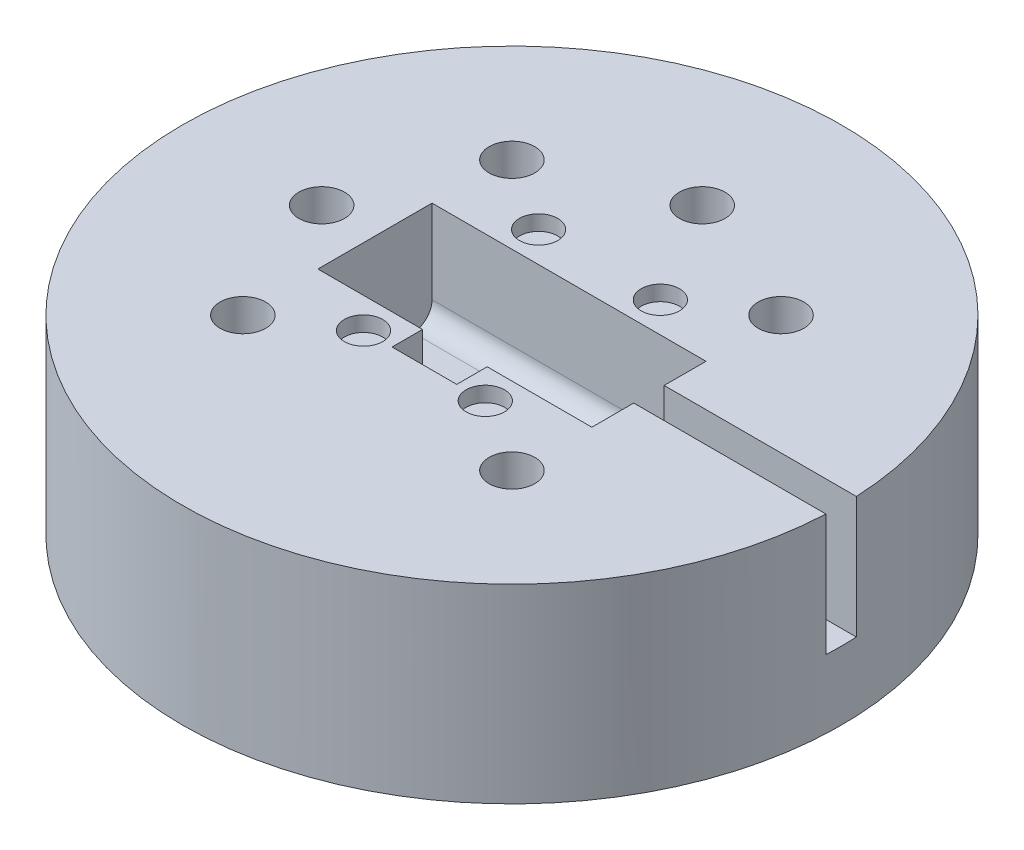
ISO-10303-21;
HEADER;
FILE_DESCRIPTION(('STEP AP214'),'2;1');
FILE_NAME('part.step','',(''),(''),'','','');
FILE_SCHEMA(('AUTOMOTIVE_DESIGN { 1 0 10303 214 1 1 1 1 }'));
ENDSEC;
DATA;
#1=APPLICATION_CONTEXT('core data for automotive mechanical design processes');
#2=APPLICATION_PROTOCOL_DEFINITION('international standard','automotive_design',2000,#1);
#3=PRODUCT_CONTEXT('',#1,'mechanical');
#4=PRODUCT('Part','Part','',(#3));
#5=PRODUCT_RELATED_PRODUCT_CATEGORY('part','',(#4));
#6=PRODUCT_DEFINITION_FORMATION('','',#4);
#7=PRODUCT_DEFINITION_CONTEXT('part definition',#1,'design');
#8=PRODUCT_DEFINITION('design','',#6,#7);
#9=PRODUCT_DEFINITION_SHAPE('','',#8);
#10=(LENGTH_UNIT() NAMED_UNIT(*) SI_UNIT(.MILLI.,.METRE.));
#11=(NAMED_UNIT(*) PLANE_ANGLE_UNIT() SI_UNIT($,.RADIAN.));
#12=(NAMED_UNIT(*) SI_UNIT($,.STERADIAN.) SOLID_ANGLE_UNIT());
#13=UNCERTAINTY_MEASURE_WITH_UNIT(LENGTH_MEASURE(1.E-05),#10,'distance_accuracy_value','');
#14=(GEOMETRIC_REPRESENTATION_CONTEXT(3) GLOBAL_UNCERTAINTY_ASSIGNED_CONTEXT((#13)) GLOBAL_UNIT_ASSIGNED_CONTEXT((#10,
#11,#12)) REPRESENTATION_CONTEXT('',''));
#15=CARTESIAN_POINT('',(0.,0.,0.));
#16=DIRECTION('',(0.,0.,1.));
#17=DIRECTION('',(1.,0.,0.));
#18=AXIS2_PLACEMENT_3D('',#15,#16,#17);
#19=CARTESIAN_POINT('',(0.,50.,0.));
#20=DIRECTION('',(0.,-1.,0.));
#21=DIRECTION('',(0.,0.,-1.));
#22=AXIS2_PLACEMENT_3D('',#19,#20,#21);
#23=CYLINDRICAL_SURFACE('',#22,86.6);
#24=CARTESIAN_POINT('',(0.,0.,0.));
#25=DIRECTION('',(0.,1.,0.));
#26=DIRECTION('',(0.,0.,1.));
#27=AXIS2_PLACEMENT_3D('',#24,#25,#26);
#28=CIRCLE('',#27,86.6);
#29=CARTESIAN_POINT('',(0.,0.,86.6));
#30=VERTEX_POINT('',#29);
#31=EDGE_CURVE('E289',#30,#30,#28,.T.);
#32=ORIENTED_EDGE('',*,*,#31,.T.);
#33=EDGE_LOOP('',(#32));
#34=FACE_BOUND('',#33,.T.);
#35=DIRECTION('',(0.,1.,0.));
#36=VECTOR('',#35,1.);
#37=CARTESIAN_POINT('',(86.5075719229248,18.,-4.));
#38=LINE('',#37,#36);
#39=CARTESIAN_POINT('',(86.5075719229248,18.,-4.));
#40=VERTEX_POINT('',#39);
#41=CARTESIAN_POINT('',(86.5075719229248,50.,-4.));
#42=VERTEX_POINT('',#41);
#43=EDGE_CURVE('E195',#40,#42,#38,.T.);
#44=ORIENTED_EDGE('',*,*,#43,.F.);
#45=CARTESIAN_POINT('',(0.,18.,0.));
#46=DIRECTION('',(0.,1.,0.));
#47=DIRECTION('',(0.,0.,1.));
#48=AXIS2_PLACEMENT_3D('',#45,#46,#47);
#49=CIRCLE('',#48,86.6);
#50=CARTESIAN_POINT('',(86.5075719229248,18.,4.));
#51=VERTEX_POINT('',#50);
#52=EDGE_CURVE('E11',#51,#40,#49,.T.);
#53=ORIENTED_EDGE('',*,*,#52,.F.);
#54=DIRECTION('',(0.,1.,0.));
#55=VECTOR('',#54,1.);
#56=CARTESIAN_POINT('',(86.5075719229248,18.,4.));
#57=LINE('',#56,#55);
#58=CARTESIAN_POINT('',(86.5075719229248,50.,4.));
#59=VERTEX_POINT('',#58);
#60=EDGE_CURVE('E199',#51,#59,#57,.T.);
#61=ORIENTED_EDGE('',*,*,#60,.T.);
#62=CARTESIAN_POINT('',(0.,50.,0.));
#63=DIRECTION('',(0.,1.,0.));
#64=DIRECTION('',(0.,0.,1.));
#65=AXIS2_PLACEMENT_3D('',#62,#63,#64);
#66=CIRCLE('',#65,86.6);
#67=EDGE_CURVE('E333',#42,#59,#66,.T.);
#68=ORIENTED_EDGE('',*,*,#67,.F.);
#69=EDGE_LOOP('',(#44,#53,#61,#68));
#70=FACE_BOUND('',#69,.T.);
#71=ADVANCED_FACE('F41',(#34,#70),#23,.T.);
#72=CARTESIAN_POINT('',(0.,50.,0.));
#73=DIRECTION('',(0.,1.,0.));
#74=DIRECTION('',(0.,0.,1.));
#75=AXIS2_PLACEMENT_3D('',#72,#73,#74);
#76=PLANE('',#75);
#77=CARTESIAN_POINT('',(-16.,50.,-23.));
#78=DIRECTION('',(0.,1.,0.));
#79=DIRECTION('',(0.,0.,1.));
#80=AXIS2_PLACEMENT_3D('',#77,#78,#79);
#81=CIRCLE('',#80,5.04298851255133);
#82=CARTESIAN_POINT('',(-16.,50.,-17.9570114874487));
#83=VERTEX_POINT('',#82);
#84=EDGE_CURVE('E557',#83,#83,#81,.T.);
#85=ORIENTED_EDGE('',*,*,#84,.F.);
#86=EDGE_LOOP('',(#85));
#87=FACE_BOUND('',#86,.T.);
#88=CARTESIAN_POINT('',(16.,50.,-23.));
#89=DIRECTION('',(0.,1.,0.));
#90=DIRECTION('',(0.,0.,1.));
#91=AXIS2_PLACEMENT_3D('',#88,#89,#90);
#92=CIRCLE('',#91,5.04298851255133);
#93=CARTESIAN_POINT('',(16.,50.,-17.9570114874487));
#94=VERTEX_POINT('',#93);
#95=EDGE_CURVE('E549',#94,#94,#92,.T.);
#96=ORIENTED_EDGE('',*,*,#95,.F.);
#97=EDGE_LOOP('',(#96));
#98=FACE_BOUND('',#97,.T.);
#99=CARTESIAN_POINT('',(16.,50.,23.));
#100=DIRECTION('',(0.,1.,0.));
#101=DIRECTION('',(0.,0.,1.));
#102=AXIS2_PLACEMENT_3D('',#99,#100,#101);
#103=CIRCLE('',#102,5.04298851255133);
#104=CARTESIAN_POINT('',(16.,50.,28.0429885125513));
#105=VERTEX_POINT('',#104);
#106=EDGE_CURVE('E537',#105,#105,#103,.T.);
#107=ORIENTED_EDGE('',*,*,#106,.F.);
#108=EDGE_LOOP('',(#107));
#109=FACE_BOUND('',#108,.T.);
#110=CARTESIAN_POINT('',(-16.,50.,23.));
#111=DIRECTION('',(0.,1.,0.));
#112=DIRECTION('',(0.,0.,1.));
#113=AXIS2_PLACEMENT_3D('',#110,#111,#112);
#114=CIRCLE('',#113,5.04298851255133);
#115=CARTESIAN_POINT('',(-16.,50.,28.0429885125513));
#116=VERTEX_POINT('',#115);
#117=EDGE_CURVE('E536',#116,#116,#114,.T.);
#118=ORIENTED_EDGE('',*,*,#117,.F.);
#119=EDGE_LOOP('',(#118));
#120=FACE_BOUND('',#119,.T.);
#121=CARTESIAN_POINT('',(0.,50.,-50.));
#122=DIRECTION('',(0.,1.,0.));
#123=DIRECTION('',(0.,0.,1.));
#124=AXIS2_PLACEMENT_3D('',#121,#122,#123);
#125=CIRCLE('',#124,6.);
#126=CARTESIAN_POINT('',(0.,50.,-44.));
#127=VERTEX_POINT('',#126);
#128=EDGE_CURVE('E290',#127,#127,#125,.T.);
#129=ORIENTED_EDGE('',*,*,#128,.F.);
#130=EDGE_LOOP('',(#129));
#131=FACE_BOUND('',#130,.T.);
#132=CARTESIAN_POINT('',(-35.3553390593268,50.,-35.3553390593259));
#133=DIRECTION('',(0.,1.,0.));
#134=DIRECTION('',(0.,0.,1.));
#135=AXIS2_PLACEMENT_3D('',#132,#133,#134);
#136=CIRCLE('',#135,6.00000000000162);
#137=CARTESIAN_POINT('',(-35.3553390593268,50.,-29.3553390593243));
#138=VERTEX_POINT('',#137);
#139=EDGE_CURVE('E262',#138,#138,#136,.T.);
#140=ORIENTED_EDGE('',*,*,#139,.F.);
#141=EDGE_LOOP('',(#140));
#142=FACE_BOUND('',#141,.T.);
#143=CARTESIAN_POINT('',(-49.9999999999979,50.,2.12856659028243E-12));
#144=DIRECTION('',(0.,1.,0.));
#145=DIRECTION('',(0.,0.,1.));
#146=AXIS2_PLACEMENT_3D('',#143,#144,#145);
#147=CIRCLE('',#146,6.00000000000315);
#148=CARTESIAN_POINT('',(-49.9999999999979,50.,6.00000000000528));
#149=VERTEX_POINT('',#148);
#150=EDGE_CURVE('E299',#149,#149,#147,.T.);
#151=ORIENTED_EDGE('',*,*,#150,.F.);
#152=EDGE_LOOP('',(#151));
#153=FACE_BOUND('',#152,.T.);
#154=CARTESIAN_POINT('',(-35.3553390593238,50.,35.3553390593289));
#155=DIRECTION('',(0.,1.,0.));
#156=DIRECTION('',(0.,0.,1.));
#157=AXIS2_PLACEMENT_3D('',#154,#155,#156);
#158=CIRCLE('',#157,6.00000000000432);
#159=CARTESIAN_POINT('',(-35.3553390593238,50.,41.3553390593332));
#160=VERTEX_POINT('',#159);
#161=EDGE_CURVE('E322',#160,#160,#158,.T.);
#162=ORIENTED_EDGE('',*,*,#161,.F.);
#163=EDGE_LOOP('',(#162));
#164=FACE_BOUND('',#163,.T.);
#165=CARTESIAN_POINT('',(35.355339059331,50.,35.3553390593259));
#166=DIRECTION('',(0.,1.,0.));
#167=DIRECTION('',(0.,0.,1.));
#168=AXIS2_PLACEMENT_3D('',#165,#166,#167);
#169=CIRCLE('',#168,6.00000000000328);
#170=CARTESIAN_POINT('',(35.355339059331,50.,41.3553390593292));
#171=VERTEX_POINT('',#170);
#172=EDGE_CURVE('E314',#171,#171,#169,.T.);
#173=ORIENTED_EDGE('',*,*,#172,.F.);
#174=EDGE_LOOP('',(#173));
#175=FACE_BOUND('',#174,.T.);
#176=CARTESIAN_POINT('',(35.355339059328,50.,-35.3553390593289));
#177=DIRECTION('',(0.,1.,0.));
#178=DIRECTION('',(0.,0.,1.));
#179=AXIS2_PLACEMENT_3D('',#176,#177,#178);
#180=CIRCLE('',#179,6.00000000000024);
#181=CARTESIAN_POINT('',(35.355339059328,50.,-29.3553390593286));
#182=VERTEX_POINT('',#181);
#183=EDGE_CURVE('E306',#182,#182,#180,.T.);
#184=ORIENTED_EDGE('',*,*,#183,.F.);
#185=EDGE_LOOP('',(#184));
#186=FACE_BOUND('',#185,.T.);
#187=DIRECTION('',(0.,0.,-1.));
#188=VECTOR('',#187,1.);
#189=CARTESIAN_POINT('',(36.,50.,0.));
#190=LINE('',#189,#188);
#191=CARTESIAN_POINT('',(36.,50.,-4.));
#192=VERTEX_POINT('',#191);
#193=CARTESIAN_POINT('',(36.,50.,-15.));
#194=VERTEX_POINT('',#193);
#195=EDGE_CURVE('E242',#192,#194,#190,.T.);
#196=ORIENTED_EDGE('',*,*,#195,.F.);
#197=DIRECTION('',(1.,0.,0.));
#198=VECTOR('',#197,1.);
#199=CARTESIAN_POINT('',(0.,50.,-4.));
#200=LINE('',#199,#198);
#201=EDGE_CURVE('E188',#192,#42,#200,.T.);
#202=ORIENTED_EDGE('',*,*,#201,.T.);
#203=ORIENTED_EDGE('',*,*,#67,.T.);
#204=DIRECTION('',(1.,0.,0.));
#205=VECTOR('',#204,1.);
#206=CARTESIAN_POINT('',(0.,50.,4.));
#207=LINE('',#206,#205);
#208=CARTESIAN_POINT('',(36.,50.,4.));
#209=VERTEX_POINT('',#208);
#210=EDGE_CURVE('E177',#209,#59,#207,.T.);
#211=ORIENTED_EDGE('',*,*,#210,.F.);
#212=CARTESIAN_POINT('',(36.,50.,15.));
#213=VERTEX_POINT('',#212);
#214=EDGE_CURVE('E244',#213,#209,#190,.T.);
#215=ORIENTED_EDGE('',*,*,#214,.F.);
#216=DIRECTION('',(1.,0.,0.));
#217=VECTOR('',#216,1.);
#218=CARTESIAN_POINT('',(0.,50.,15.));
#219=LINE('',#218,#217);
#220=CARTESIAN_POINT('',(8.5,50.,15.));
#221=VERTEX_POINT('',#220);
#222=EDGE_CURVE('E238',#221,#213,#219,.T.);
#223=ORIENTED_EDGE('',*,*,#222,.F.);
#224=DIRECTION('',(0.,0.,-1.));
#225=VECTOR('',#224,1.);
#226=CARTESIAN_POINT('',(8.5,50.,0.));
#227=LINE('',#226,#225);
#228=CARTESIAN_POINT('',(8.5,50.,23.));
#229=VERTEX_POINT('',#228);
#230=EDGE_CURVE('E234',#229,#221,#227,.T.);
#231=ORIENTED_EDGE('',*,*,#230,.F.);
#232=DIRECTION('',(1.,0.,0.));
#233=VECTOR('',#232,1.);
#234=CARTESIAN_POINT('',(0.,50.,23.));
#235=LINE('',#234,#233);
#236=CARTESIAN_POINT('',(-8.5,50.,23.));
#237=VERTEX_POINT('',#236);
#238=EDGE_CURVE('E211',#237,#229,#235,.T.);
#239=ORIENTED_EDGE('',*,*,#238,.F.);
#240=DIRECTION('',(0.,0.,-1.));
#241=VECTOR('',#240,1.);
#242=CARTESIAN_POINT('',(-8.5,50.,0.));
#243=LINE('',#242,#241);
#244=CARTESIAN_POINT('',(-8.5,50.,15.));
#245=VERTEX_POINT('',#244);
#246=EDGE_CURVE('E217',#237,#245,#243,.T.);
#247=ORIENTED_EDGE('',*,*,#246,.T.);
#248=CARTESIAN_POINT('',(-36.,50.,15.));
#249=VERTEX_POINT('',#248);
#250=EDGE_CURVE('E243',#249,#245,#219,.T.);
#251=ORIENTED_EDGE('',*,*,#250,.F.);
#252=DIRECTION('',(0.,0.,-1.));
#253=VECTOR('',#252,1.);
#254=CARTESIAN_POINT('',(-36.,50.,0.));
#255=LINE('',#254,#253);
#256=CARTESIAN_POINT('',(-36.,50.,-15.));
#257=VERTEX_POINT('',#256);
#258=EDGE_CURVE('E252',#249,#257,#255,.T.);
#259=ORIENTED_EDGE('',*,*,#258,.T.);
#260=DIRECTION('',(1.,0.,0.));
#261=VECTOR('',#260,1.);
#262=CARTESIAN_POINT('',(0.,50.,-15.));
#263=LINE('',#262,#261);
#264=EDGE_CURVE('E248',#257,#194,#263,.T.);
#265=ORIENTED_EDGE('',*,*,#264,.T.);
#266=EDGE_LOOP('',(#196,#202,#203,#211,#215,#223,#231,#239,#247,#251,#259,#265));
#267=FACE_BOUND('',#266,.T.);
#268=ADVANCED_FACE('F407',(#87,#98,#109,#120,#131,#142,#153,#164,#175,#186,#267),#76,.T.);
#269=CARTESIAN_POINT('',(36.,23.,0.));
#270=DIRECTION('',(1.,0.,0.));
#271=DIRECTION('',(0.,0.,-1.));
#272=AXIS2_PLACEMENT_3D('',#269,#270,#271);
#273=PLANE('',#272);
#274=DIRECTION('',(0.,-1.,0.));
#275=VECTOR('',#274,1.);
#276=CARTESIAN_POINT('',(36.,23.,-4.));
#277=LINE('',#276,#275);
#278=CARTESIAN_POINT('',(36.,23.,-4.));
#279=VERTEX_POINT('',#278);
#280=EDGE_CURVE('E208',#192,#279,#277,.T.);
#281=ORIENTED_EDGE('',*,*,#280,.F.);
#282=ORIENTED_EDGE('',*,*,#195,.T.);
#283=DIRECTION('',(0.,1.,0.));
#284=VECTOR('',#283,1.);
#285=CARTESIAN_POINT('',(36.,23.,-15.));
#286=LINE('',#285,#284);
#287=CARTESIAN_POINT('',(36.,28.,-15.));
#288=VERTEX_POINT('',#287);
#289=EDGE_CURVE('E272',#288,#194,#286,.T.);
#290=ORIENTED_EDGE('',*,*,#289,.F.);
#291=CARTESIAN_POINT('',(36.,28.,-10.));
#292=DIRECTION('',(1.,0.,0.));
#293=DIRECTION('',(0.,0.,-1.));
#294=AXIS2_PLACEMENT_3D('',#291,#292,#293);
#295=CIRCLE('',#294,5.);
#296=CARTESIAN_POINT('',(36.,23.,-10.));
#297=VERTEX_POINT('',#296);
#298=EDGE_CURVE('E344',#288,#297,#295,.F.);
#299=ORIENTED_EDGE('',*,*,#298,.T.);
#300=DIRECTION('',(0.,0.,-1.));
#301=VECTOR('',#300,1.);
#302=CARTESIAN_POINT('',(36.,23.,0.));
#303=LINE('',#302,#301);
#304=EDGE_CURVE('E220',#279,#297,#303,.T.);
#305=ORIENTED_EDGE('',*,*,#304,.F.);
#306=EDGE_LOOP('',(#281,#282,#290,#299,#305));
#307=FACE_BOUND('',#306,.T.);
#308=ADVANCED_FACE('F393',(#307),#273,.F.);
#309=CARTESIAN_POINT('',(0.,23.,0.));
#310=DIRECTION('',(0.,1.,0.));
#311=DIRECTION('',(0.,0.,1.));
#312=AXIS2_PLACEMENT_3D('',#309,#310,#311);
#313=PLANE('',#312);
#314=CARTESIAN_POINT('',(18.5075719229248,23.,0.));
#315=DIRECTION('',(0.,1.,0.));
#316=DIRECTION('',(0.,0.,1.));
#317=AXIS2_PLACEMENT_3D('',#314,#315,#316);
#318=CIRCLE('',#317,3.99999999999999);
#319=CARTESIAN_POINT('',(18.5075719229248,23.,-3.99999999999999));
#320=VERTEX_POINT('',#319);
#321=CARTESIAN_POINT('',(18.5075719229248,23.,4.));
#322=VERTEX_POINT('',#321);
#323=EDGE_CURVE('E381',#320,#322,#318,.T.);
#324=ORIENTED_EDGE('',*,*,#323,.F.);
#325=DIRECTION('',(1.,0.,0.));
#326=VECTOR('',#325,1.);
#327=CARTESIAN_POINT('',(0.,23.,-4.));
#328=LINE('',#327,#326);
#329=EDGE_CURVE('E50',#320,#279,#328,.T.);
#330=ORIENTED_EDGE('',*,*,#329,.T.);
#331=ORIENTED_EDGE('',*,*,#304,.T.);
#332=DIRECTION('',(1.,0.,0.));
#333=VECTOR('',#332,1.);
#334=CARTESIAN_POINT('',(-36.,23.,-10.));
#335=LINE('',#334,#333);
#336=CARTESIAN_POINT('',(-36.,23.,-10.));
#337=VERTEX_POINT('',#336);
#338=EDGE_CURVE('E348',#297,#337,#335,.F.);
#339=ORIENTED_EDGE('',*,*,#338,.T.);
#340=DIRECTION('',(0.,0.,-1.));
#341=VECTOR('',#340,1.);
#342=CARTESIAN_POINT('',(-36.,23.,0.));
#343=LINE('',#342,#341);
#344=CARTESIAN_POINT('',(-36.,23.,10.));
#345=VERTEX_POINT('',#344);
#346=EDGE_CURVE('E225',#345,#337,#343,.T.);
#347=ORIENTED_EDGE('',*,*,#346,.F.);
#348=DIRECTION('',(1.,0.,0.));
#349=VECTOR('',#348,1.);
#350=CARTESIAN_POINT('',(0.,23.,10.));
#351=LINE('',#350,#349);
#352=CARTESIAN_POINT('',(-8.5,23.,10.));
#353=VERTEX_POINT('',#352);
#354=EDGE_CURVE('E355',#345,#353,#351,.T.);
#355=ORIENTED_EDGE('',*,*,#354,.T.);
#356=DIRECTION('',(0.,0.,-1.));
#357=VECTOR('',#356,1.);
#358=CARTESIAN_POINT('',(-8.5,23.,0.));
#359=LINE('',#358,#357);
#360=CARTESIAN_POINT('',(-8.5,23.,23.));
#361=VERTEX_POINT('',#360);
#362=EDGE_CURVE('E228',#361,#353,#359,.T.);
#363=ORIENTED_EDGE('',*,*,#362,.F.);
#364=DIRECTION('',(1.,0.,0.));
#365=VECTOR('',#364,1.);
#366=CARTESIAN_POINT('',(0.,23.,23.));
#367=LINE('',#366,#365);
#368=CARTESIAN_POINT('',(8.5,23.,23.));
#369=VERTEX_POINT('',#368);
#370=EDGE_CURVE('E212',#361,#369,#367,.T.);
#371=ORIENTED_EDGE('',*,*,#370,.T.);
#372=DIRECTION('',(0.,0.,-1.));
#373=VECTOR('',#372,1.);
#374=CARTESIAN_POINT('',(8.5,23.,0.));
#375=LINE('',#374,#373);
#376=CARTESIAN_POINT('',(8.5,23.,10.));
#377=VERTEX_POINT('',#376);
#378=EDGE_CURVE('E216',#369,#377,#375,.T.);
#379=ORIENTED_EDGE('',*,*,#378,.T.);
#380=DIRECTION('',(1.,0.,0.));
#381=VECTOR('',#380,1.);
#382=CARTESIAN_POINT('',(0.,23.,10.));
#383=LINE('',#382,#381);
#384=CARTESIAN_POINT('',(36.,23.,10.));
#385=VERTEX_POINT('',#384);
#386=EDGE_CURVE('E359',#377,#385,#383,.T.);
#387=ORIENTED_EDGE('',*,*,#386,.T.);
#388=CARTESIAN_POINT('',(36.,23.,4.));
#389=VERTEX_POINT('',#388);
#390=EDGE_CURVE('E221',#385,#389,#303,.T.);
#391=ORIENTED_EDGE('',*,*,#390,.T.);
#392=DIRECTION('',(1.,0.,0.));
#393=VECTOR('',#392,1.);
#394=CARTESIAN_POINT('',(0.,23.,4.));
#395=LINE('',#394,#393);
#396=EDGE_CURVE('E384',#322,#389,#395,.T.);
#397=ORIENTED_EDGE('',*,*,#396,.F.);
#398=EDGE_LOOP('',(#324,#330,#331,#339,#347,#355,#363,#371,#379,#387,#391,#397));
#399=FACE_BOUND('',#398,.T.);
#400=ADVANCED_FACE('F389',(#399),#313,.T.);
#401=CARTESIAN_POINT('',(0.,0.,0.));
#402=DIRECTION('',(0.,1.,0.));
#403=DIRECTION('',(0.,0.,1.));
#404=AXIS2_PLACEMENT_3D('',#401,#402,#403);
#405=PLANE('',#404);
#406=CARTESIAN_POINT('',(0.,0.,-50.));
#407=DIRECTION('',(0.,1.,0.));
#408=DIRECTION('',(0.,0.,1.));
#409=AXIS2_PLACEMENT_3D('',#406,#407,#408);
#410=CIRCLE('',#409,6.);
#411=CARTESIAN_POINT('',(0.,0.,-44.));
#412=VERTEX_POINT('',#411);
#413=EDGE_CURVE('E285',#412,#412,#410,.T.);
#414=ORIENTED_EDGE('',*,*,#413,.T.);
#415=EDGE_LOOP('',(#414));
#416=FACE_BOUND('',#415,.T.);
#417=CARTESIAN_POINT('',(-35.3553390593268,0.,-35.3553390593259));
#418=DIRECTION('',(0.,1.,0.));
#419=DIRECTION('',(0.,0.,1.));
#420=AXIS2_PLACEMENT_3D('',#417,#418,#419);
#421=CIRCLE('',#420,6.00000000000162);
#422=CARTESIAN_POINT('',(-35.3553390593268,0.,-29.3553390593243));
#423=VERTEX_POINT('',#422);
#424=EDGE_CURVE('E295',#423,#423,#421,.T.);
#425=ORIENTED_EDGE('',*,*,#424,.T.);
#426=EDGE_LOOP('',(#425));
#427=FACE_BOUND('',#426,.T.);
#428=CARTESIAN_POINT('',(-49.9999999999979,0.,2.12856659028243E-12));
#429=DIRECTION('',(0.,1.,0.));
#430=DIRECTION('',(0.,0.,1.));
#431=AXIS2_PLACEMENT_3D('',#428,#429,#430);
#432=CIRCLE('',#431,6.00000000000315);
#433=CARTESIAN_POINT('',(-49.9999999999979,0.,6.00000000000528));
#434=VERTEX_POINT('',#433);
#435=EDGE_CURVE('E326',#434,#434,#432,.T.);
#436=ORIENTED_EDGE('',*,*,#435,.T.);
#437=EDGE_LOOP('',(#436));
#438=FACE_BOUND('',#437,.T.);
#439=CARTESIAN_POINT('',(-35.3553390593238,0.,35.3553390593289));
#440=DIRECTION('',(0.,1.,0.));
#441=DIRECTION('',(0.,0.,1.));
#442=AXIS2_PLACEMENT_3D('',#439,#440,#441);
#443=CIRCLE('',#442,6.00000000000432);
#444=CARTESIAN_POINT('',(-35.3553390593238,0.,41.3553390593332));
#445=VERTEX_POINT('',#444);
#446=EDGE_CURVE('E318',#445,#445,#443,.T.);
#447=ORIENTED_EDGE('',*,*,#446,.T.);
#448=EDGE_LOOP('',(#447));
#449=FACE_BOUND('',#448,.T.);
#450=CARTESIAN_POINT('',(35.355339059331,0.,35.3553390593259));
#451=DIRECTION('',(0.,1.,0.));
#452=DIRECTION('',(0.,0.,1.));
#453=AXIS2_PLACEMENT_3D('',#450,#451,#452);
#454=CIRCLE('',#453,6.00000000000328);
#455=CARTESIAN_POINT('',(35.355339059331,0.,41.3553390593292));
#456=VERTEX_POINT('',#455);
#457=EDGE_CURVE('E310',#456,#456,#454,.T.);
#458=ORIENTED_EDGE('',*,*,#457,.T.);
#459=EDGE_LOOP('',(#458));
#460=FACE_BOUND('',#459,.T.);
#461=CARTESIAN_POINT('',(35.355339059328,0.,-35.3553390593289));
#462=DIRECTION('',(0.,1.,0.));
#463=DIRECTION('',(0.,0.,1.));
#464=AXIS2_PLACEMENT_3D('',#461,#462,#463);
#465=CIRCLE('',#464,6.00000000000024);
#466=CARTESIAN_POINT('',(35.355339059328,0.,-29.3553390593286));
#467=VERTEX_POINT('',#466);
#468=EDGE_CURVE('E294',#467,#467,#465,.T.);
#469=ORIENTED_EDGE('',*,*,#468,.T.);
#470=EDGE_LOOP('',(#469));
#471=FACE_BOUND('',#470,.T.);
#472=ORIENTED_EDGE('',*,*,#31,.F.);
#473=EDGE_LOOP('',(#472));
#474=FACE_BOUND('',#473,.T.);
#475=ADVANCED_FACE('F458',(#416,#427,#438,#449,#460,#471,#474),#405,.F.);
#476=CARTESIAN_POINT('',(35.355339059328,0.,-35.3553390593289));
#477=DIRECTION('',(0.,1.,0.));
#478=DIRECTION('',(0.,0.,1.));
#479=AXIS2_PLACEMENT_3D('',#476,#477,#478);
#480=CYLINDRICAL_SURFACE('',#479,6.00000000000024);
#481=ORIENTED_EDGE('',*,*,#468,.F.);
#482=EDGE_LOOP('',(#481));
#483=FACE_BOUND('',#482,.T.);
#484=ORIENTED_EDGE('',*,*,#183,.T.);
#485=EDGE_LOOP('',(#484));
#486=FACE_BOUND('',#485,.T.);
#487=ADVANCED_FACE('F580',(#483,#486),#480,.F.);
#488=CARTESIAN_POINT('',(35.355339059331,0.,35.3553390593259));
#489=DIRECTION('',(0.,1.,0.));
#490=DIRECTION('',(0.,0.,1.));
#491=AXIS2_PLACEMENT_3D('',#488,#489,#490);
#492=CYLINDRICAL_SURFACE('',#491,6.00000000000328);
#493=ORIENTED_EDGE('',*,*,#457,.F.);
#494=EDGE_LOOP('',(#493));
#495=FACE_BOUND('',#494,.T.);
#496=ORIENTED_EDGE('',*,*,#172,.T.);
#497=EDGE_LOOP('',(#496));
#498=FACE_BOUND('',#497,.T.);
#499=ADVANCED_FACE('F582',(#495,#498),#492,.F.);
#500=CARTESIAN_POINT('',(-35.3553390593238,0.,35.3553390593289));
#501=DIRECTION('',(0.,1.,0.));
#502=DIRECTION('',(0.,0.,1.));
#503=AXIS2_PLACEMENT_3D('',#500,#501,#502);
#504=CYLINDRICAL_SURFACE('',#503,6.00000000000432);
#505=ORIENTED_EDGE('',*,*,#446,.F.);
#506=EDGE_LOOP('',(#505));
#507=FACE_BOUND('',#506,.T.);
#508=ORIENTED_EDGE('',*,*,#161,.T.);
#509=EDGE_LOOP('',(#508));
#510=FACE_BOUND('',#509,.T.);
#511=ADVANCED_FACE('F589',(#507,#510),#504,.F.);
#512=CARTESIAN_POINT('',(-49.9999999999979,0.,2.12856659028243E-12));
#513=DIRECTION('',(0.,1.,0.));
#514=DIRECTION('',(0.,0.,1.));
#515=AXIS2_PLACEMENT_3D('',#512,#513,#514);
#516=CYLINDRICAL_SURFACE('',#515,6.00000000000315);
#517=ORIENTED_EDGE('',*,*,#435,.F.);
#518=EDGE_LOOP('',(#517));
#519=FACE_BOUND('',#518,.T.);
#520=ORIENTED_EDGE('',*,*,#150,.T.);
#521=EDGE_LOOP('',(#520));
#522=FACE_BOUND('',#521,.T.);
#523=ADVANCED_FACE('F600',(#519,#522),#516,.F.);
#524=CARTESIAN_POINT('',(-35.3553390593268,0.,-35.3553390593259));
#525=DIRECTION('',(0.,1.,0.));
#526=DIRECTION('',(0.,0.,1.));
#527=AXIS2_PLACEMENT_3D('',#524,#525,#526);
#528=CYLINDRICAL_SURFACE('',#527,6.00000000000162);
#529=ORIENTED_EDGE('',*,*,#424,.F.);
#530=EDGE_LOOP('',(#529));
#531=FACE_BOUND('',#530,.T.);
#532=ORIENTED_EDGE('',*,*,#139,.T.);
#533=EDGE_LOOP('',(#532));
#534=FACE_BOUND('',#533,.T.);
#535=ADVANCED_FACE('F595',(#531,#534),#528,.F.);
#536=CARTESIAN_POINT('',(0.,0.,-50.));
#537=DIRECTION('',(0.,1.,0.));
#538=DIRECTION('',(0.,0.,1.));
#539=AXIS2_PLACEMENT_3D('',#536,#537,#538);
#540=CYLINDRICAL_SURFACE('',#539,6.);
#541=ORIENTED_EDGE('',*,*,#413,.F.);
#542=EDGE_LOOP('',(#541));
#543=FACE_BOUND('',#542,.T.);
#544=ORIENTED_EDGE('',*,*,#128,.T.);
#545=EDGE_LOOP('',(#544));
#546=FACE_BOUND('',#545,.T.);
#547=ADVANCED_FACE('F486',(#543,#546),#540,.F.);
#548=CARTESIAN_POINT('',(0.,23.,23.));
#549=DIRECTION('',(0.,0.,1.));
#550=DIRECTION('',(1.,0.,0.));
#551=AXIS2_PLACEMENT_3D('',#548,#549,#550);
#552=PLANE('',#551);
#553=ORIENTED_EDGE('',*,*,#238,.T.);
#554=DIRECTION('',(0.,1.,0.));
#555=VECTOR('',#554,1.);
#556=CARTESIAN_POINT('',(8.5,23.,23.));
#557=LINE('',#556,#555);
#558=EDGE_CURVE('E231',#369,#229,#557,.T.);
#559=ORIENTED_EDGE('',*,*,#558,.F.);
#560=ORIENTED_EDGE('',*,*,#370,.F.);
#561=DIRECTION('',(0.,1.,0.));
#562=VECTOR('',#561,1.);
#563=CARTESIAN_POINT('',(-8.5,23.,23.));
#564=LINE('',#563,#562);
#565=EDGE_CURVE('E259',#361,#237,#564,.T.);
#566=ORIENTED_EDGE('',*,*,#565,.T.);
#567=EDGE_LOOP('',(#553,#559,#560,#566));
#568=FACE_BOUND('',#567,.T.);
#569=ADVANCED_FACE('F429',(#568),#552,.F.);
#570=CARTESIAN_POINT('',(-8.5,23.,0.));
#571=DIRECTION('',(1.,0.,0.));
#572=DIRECTION('',(0.,0.,-1.));
#573=AXIS2_PLACEMENT_3D('',#570,#571,#572);
#574=PLANE('',#573);
#575=ORIENTED_EDGE('',*,*,#246,.F.);
#576=ORIENTED_EDGE('',*,*,#565,.F.);
#577=ORIENTED_EDGE('',*,*,#362,.T.);
#578=CARTESIAN_POINT('',(-8.5,28.,10.));
#579=DIRECTION('',(1.,0.,0.));
#580=DIRECTION('',(0.,0.,-1.));
#581=AXIS2_PLACEMENT_3D('',#578,#579,#580);
#582=CIRCLE('',#581,5.);
#583=CARTESIAN_POINT('',(-8.5,28.,15.));
#584=VERTEX_POINT('',#583);
#585=EDGE_CURVE('E378',#353,#584,#582,.F.);
#586=ORIENTED_EDGE('',*,*,#585,.T.);
#587=DIRECTION('',(0.,1.,0.));
#588=VECTOR('',#587,1.);
#589=CARTESIAN_POINT('',(-8.5,23.,15.));
#590=LINE('',#589,#588);
#591=EDGE_CURVE('E263',#584,#245,#590,.T.);
#592=ORIENTED_EDGE('',*,*,#591,.T.);
#593=EDGE_LOOP('',(#575,#576,#577,#586,#592));
#594=FACE_BOUND('',#593,.T.);
#595=ADVANCED_FACE('F423',(#594),#574,.T.);
#596=CARTESIAN_POINT('',(0.,23.,15.));
#597=DIRECTION('',(0.,0.,1.));
#598=DIRECTION('',(1.,0.,0.));
#599=AXIS2_PLACEMENT_3D('',#596,#597,#598);
#600=PLANE('',#599);
#601=ORIENTED_EDGE('',*,*,#591,.F.);
#602=DIRECTION('',(1.,0.,0.));
#603=VECTOR('',#602,1.);
#604=CARTESIAN_POINT('',(0.,28.,15.));
#605=LINE('',#604,#603);
#606=CARTESIAN_POINT('',(-36.,28.,15.));
#607=VERTEX_POINT('',#606);
#608=EDGE_CURVE('E65',#584,#607,#605,.F.);
#609=ORIENTED_EDGE('',*,*,#608,.T.);
#610=DIRECTION('',(0.,1.,0.));
#611=VECTOR('',#610,1.);
#612=CARTESIAN_POINT('',(-36.,23.,15.));
#613=LINE('',#612,#611);
#614=EDGE_CURVE('E266',#607,#249,#613,.T.);
#615=ORIENTED_EDGE('',*,*,#614,.T.);
#616=ORIENTED_EDGE('',*,*,#250,.T.);
#617=EDGE_LOOP('',(#601,#609,#615,#616));
#618=FACE_BOUND('',#617,.T.);
#619=ADVANCED_FACE('F424',(#618),#600,.F.);
#620=CARTESIAN_POINT('',(-36.,23.,0.));
#621=DIRECTION('',(1.,0.,0.));
#622=DIRECTION('',(0.,0.,-1.));
#623=AXIS2_PLACEMENT_3D('',#620,#621,#622);
#624=PLANE('',#623);
#625=ORIENTED_EDGE('',*,*,#614,.F.);
#626=CARTESIAN_POINT('',(-36.,28.,10.));
#627=DIRECTION('',(1.,0.,0.));
#628=DIRECTION('',(0.,0.,-1.));
#629=AXIS2_PLACEMENT_3D('',#626,#627,#628);
#630=CIRCLE('',#629,5.);
#631=EDGE_CURVE('E371',#607,#345,#630,.T.);
#632=ORIENTED_EDGE('',*,*,#631,.T.);
#633=ORIENTED_EDGE('',*,*,#346,.T.);
#634=CARTESIAN_POINT('',(-36.,28.,-10.));
#635=DIRECTION('',(1.,0.,0.));
#636=DIRECTION('',(0.,0.,-1.));
#637=AXIS2_PLACEMENT_3D('',#634,#635,#636);
#638=CIRCLE('',#637,5.);
#639=CARTESIAN_POINT('',(-36.,28.,-15.));
#640=VERTEX_POINT('',#639);
#641=EDGE_CURVE('E352',#337,#640,#638,.T.);
#642=ORIENTED_EDGE('',*,*,#641,.T.);
#643=DIRECTION('',(0.,1.,0.));
#644=VECTOR('',#643,1.);
#645=CARTESIAN_POINT('',(-36.,23.,-15.));
#646=LINE('',#645,#644);
#647=EDGE_CURVE('E269',#640,#257,#646,.T.);
#648=ORIENTED_EDGE('',*,*,#647,.T.);
#649=ORIENTED_EDGE('',*,*,#258,.F.);
#650=EDGE_LOOP('',(#625,#632,#633,#642,#648,#649));
#651=FACE_BOUND('',#650,.T.);
#652=ADVANCED_FACE('F411',(#651),#624,.T.);
#653=CARTESIAN_POINT('',(0.,23.,-15.));
#654=DIRECTION('',(0.,0.,1.));
#655=DIRECTION('',(1.,0.,0.));
#656=AXIS2_PLACEMENT_3D('',#653,#654,#655);
#657=PLANE('',#656);
#658=ORIENTED_EDGE('',*,*,#647,.F.);
#659=DIRECTION('',(1.,0.,0.));
#660=VECTOR('',#659,1.);
#661=CARTESIAN_POINT('',(36.,28.,-15.));
#662=LINE('',#661,#660);
#663=EDGE_CURVE('E337',#640,#288,#662,.T.);
#664=ORIENTED_EDGE('',*,*,#663,.T.);
#665=ORIENTED_EDGE('',*,*,#289,.T.);
#666=ORIENTED_EDGE('',*,*,#264,.F.);
#667=EDGE_LOOP('',(#658,#664,#665,#666));
#668=FACE_BOUND('',#667,.T.);
#669=ADVANCED_FACE('F405',(#668),#657,.T.);
#670=ORIENTED_EDGE('',*,*,#214,.T.);
#671=DIRECTION('',(0.,-1.,0.));
#672=VECTOR('',#671,1.);
#673=CARTESIAN_POINT('',(36.,23.,4.));
#674=LINE('',#673,#672);
#675=EDGE_CURVE('E198',#209,#389,#674,.T.);
#676=ORIENTED_EDGE('',*,*,#675,.T.);
#677=ORIENTED_EDGE('',*,*,#390,.F.);
#678=CARTESIAN_POINT('',(36.,28.,10.));
#679=DIRECTION('',(1.,0.,0.));
#680=DIRECTION('',(0.,0.,-1.));
#681=AXIS2_PLACEMENT_3D('',#678,#679,#680);
#682=CIRCLE('',#681,5.);
#683=CARTESIAN_POINT('',(36.,28.,15.));
#684=VERTEX_POINT('',#683);
#685=EDGE_CURVE('E363',#385,#684,#682,.F.);
#686=ORIENTED_EDGE('',*,*,#685,.T.);
#687=DIRECTION('',(0.,1.,0.));
#688=VECTOR('',#687,1.);
#689=CARTESIAN_POINT('',(36.,23.,15.));
#690=LINE('',#689,#688);
#691=EDGE_CURVE('E276',#684,#213,#690,.T.);
#692=ORIENTED_EDGE('',*,*,#691,.T.);
#693=EDGE_LOOP('',(#670,#676,#677,#686,#692));
#694=FACE_BOUND('',#693,.T.);
#695=ADVANCED_FACE('F439',(#694),#273,.F.);
#696=ORIENTED_EDGE('',*,*,#691,.F.);
#697=DIRECTION('',(1.,0.,0.));
#698=VECTOR('',#697,1.);
#699=CARTESIAN_POINT('',(0.,28.,15.));
#700=LINE('',#699,#698);
#701=CARTESIAN_POINT('',(8.5,28.,15.));
#702=VERTEX_POINT('',#701);
#703=EDGE_CURVE('E366',#684,#702,#700,.F.);
#704=ORIENTED_EDGE('',*,*,#703,.T.);
#705=DIRECTION('',(0.,1.,0.));
#706=VECTOR('',#705,1.);
#707=CARTESIAN_POINT('',(8.5,23.,15.));
#708=LINE('',#707,#706);
#709=EDGE_CURVE('E279',#702,#221,#708,.T.);
#710=ORIENTED_EDGE('',*,*,#709,.T.);
#711=ORIENTED_EDGE('',*,*,#222,.T.);
#712=EDGE_LOOP('',(#696,#704,#710,#711));
#713=FACE_BOUND('',#712,.T.);
#714=ADVANCED_FACE('F467',(#713),#600,.F.);
#715=CARTESIAN_POINT('',(8.5,23.,0.));
#716=DIRECTION('',(1.,0.,0.));
#717=DIRECTION('',(0.,0.,-1.));
#718=AXIS2_PLACEMENT_3D('',#715,#716,#717);
#719=PLANE('',#718);
#720=ORIENTED_EDGE('',*,*,#230,.T.);
#721=ORIENTED_EDGE('',*,*,#709,.F.);
#722=CARTESIAN_POINT('',(8.5,28.,10.));
#723=DIRECTION('',(1.,0.,0.));
#724=DIRECTION('',(0.,0.,-1.));
#725=AXIS2_PLACEMENT_3D('',#722,#723,#724);
#726=CIRCLE('',#725,5.);
#727=EDGE_CURVE('E374',#702,#377,#726,.T.);
#728=ORIENTED_EDGE('',*,*,#727,.T.);
#729=ORIENTED_EDGE('',*,*,#378,.F.);
#730=ORIENTED_EDGE('',*,*,#558,.T.);
#731=EDGE_LOOP('',(#720,#721,#728,#729,#730));
#732=FACE_BOUND('',#731,.T.);
#733=ADVANCED_FACE('F432',(#732),#719,.F.);
#734=CARTESIAN_POINT('',(0.,28.,-10.));
#735=DIRECTION('',(-1.,0.,0.));
#736=DIRECTION('',(0.,0.,1.));
#737=AXIS2_PLACEMENT_3D('',#734,#735,#736);
#738=CYLINDRICAL_SURFACE('',#737,5.);
#739=ORIENTED_EDGE('',*,*,#641,.F.);
#740=ORIENTED_EDGE('',*,*,#338,.F.);
#741=ORIENTED_EDGE('',*,*,#298,.F.);
#742=ORIENTED_EDGE('',*,*,#663,.F.);
#743=EDGE_LOOP('',(#739,#740,#741,#742));
#744=FACE_BOUND('',#743,.T.);
#745=ADVANCED_FACE('F415',(#744),#738,.F.);
#746=CARTESIAN_POINT('',(0.,28.,10.));
#747=DIRECTION('',(1.,0.,0.));
#748=DIRECTION('',(0.,0.,-1.));
#749=AXIS2_PLACEMENT_3D('',#746,#747,#748);
#750=CYLINDRICAL_SURFACE('',#749,5.);
#751=ORIENTED_EDGE('',*,*,#727,.F.);
#752=ORIENTED_EDGE('',*,*,#703,.F.);
#753=ORIENTED_EDGE('',*,*,#685,.F.);
#754=ORIENTED_EDGE('',*,*,#386,.F.);
#755=EDGE_LOOP('',(#751,#752,#753,#754));
#756=FACE_BOUND('',#755,.T.);
#757=ADVANCED_FACE('F460',(#756),#750,.F.);
#758=CARTESIAN_POINT('',(0.,28.,10.));
#759=DIRECTION('',(1.,0.,0.));
#760=DIRECTION('',(0.,0.,-1.));
#761=AXIS2_PLACEMENT_3D('',#758,#759,#760);
#762=CYLINDRICAL_SURFACE('',#761,5.);
#763=ORIENTED_EDGE('',*,*,#631,.F.);
#764=ORIENTED_EDGE('',*,*,#608,.F.);
#765=ORIENTED_EDGE('',*,*,#585,.F.);
#766=ORIENTED_EDGE('',*,*,#354,.F.);
#767=EDGE_LOOP('',(#763,#764,#765,#766));
#768=FACE_BOUND('',#767,.T.);
#769=ADVANCED_FACE('F43',(#768),#762,.F.);
#770=CARTESIAN_POINT('',(0.,18.,0.));
#771=DIRECTION('',(0.,1.,0.));
#772=DIRECTION('',(0.,0.,1.));
#773=AXIS2_PLACEMENT_3D('',#770,#771,#772);
#774=PLANE('',#773);
#775=ORIENTED_EDGE('',*,*,#52,.T.);
#776=DIRECTION('',(1.,0.,0.));
#777=VECTOR('',#776,1.);
#778=CARTESIAN_POINT('',(0.,18.,-4.));
#779=LINE('',#778,#777);
#780=CARTESIAN_POINT('',(18.5075719229248,18.,-4.));
#781=VERTEX_POINT('',#780);
#782=EDGE_CURVE('E162',#781,#40,#779,.T.);
#783=ORIENTED_EDGE('',*,*,#782,.F.);
#784=CARTESIAN_POINT('',(18.5075719229248,18.,0.));
#785=DIRECTION('',(0.,1.,0.));
#786=DIRECTION('',(0.,0.,1.));
#787=AXIS2_PLACEMENT_3D('',#784,#785,#786);
#788=CIRCLE('',#787,3.99999999999999);
#789=CARTESIAN_POINT('',(18.5075719229248,18.,4.));
#790=VERTEX_POINT('',#789);
#791=EDGE_CURVE('E174',#781,#790,#788,.T.);
#792=ORIENTED_EDGE('',*,*,#791,.T.);
#793=DIRECTION('',(1.,0.,0.));
#794=VECTOR('',#793,1.);
#795=CARTESIAN_POINT('',(0.,18.,4.));
#796=LINE('',#795,#794);
#797=EDGE_CURVE('E168',#790,#51,#796,.T.);
#798=ORIENTED_EDGE('',*,*,#797,.T.);
#799=EDGE_LOOP('',(#775,#783,#792,#798));
#800=FACE_BOUND('',#799,.T.);
#801=ADVANCED_FACE('F172',(#800),#774,.T.);
#802=CARTESIAN_POINT('',(0.,18.,-4.));
#803=DIRECTION('',(0.,0.,1.));
#804=DIRECTION('',(1.,0.,0.));
#805=AXIS2_PLACEMENT_3D('',#802,#803,#804);
#806=PLANE('',#805);
#807=ORIENTED_EDGE('',*,*,#280,.T.);
#808=ORIENTED_EDGE('',*,*,#329,.F.);
#809=DIRECTION('',(0.,1.,0.));
#810=VECTOR('',#809,1.);
#811=CARTESIAN_POINT('',(18.5075719229248,18.,-4.));
#812=LINE('',#811,#810);
#813=EDGE_CURVE('E57',#781,#320,#812,.T.);
#814=ORIENTED_EDGE('',*,*,#813,.F.);
#815=ORIENTED_EDGE('',*,*,#782,.T.);
#816=ORIENTED_EDGE('',*,*,#43,.T.);
#817=ORIENTED_EDGE('',*,*,#201,.F.);
#818=EDGE_LOOP('',(#807,#808,#814,#815,#816,#817));
#819=FACE_BOUND('',#818,.T.);
#820=ADVANCED_FACE('F161',(#819),#806,.T.);
#821=CARTESIAN_POINT('',(0.,18.,4.));
#822=DIRECTION('',(0.,0.,1.));
#823=DIRECTION('',(1.,0.,0.));
#824=AXIS2_PLACEMENT_3D('',#821,#822,#823);
#825=PLANE('',#824);
#826=ORIENTED_EDGE('',*,*,#210,.T.);
#827=ORIENTED_EDGE('',*,*,#60,.F.);
#828=ORIENTED_EDGE('',*,*,#797,.F.);
#829=DIRECTION('',(0.,1.,0.));
#830=VECTOR('',#829,1.);
#831=CARTESIAN_POINT('',(18.5075719229248,18.,4.));
#832=LINE('',#831,#830);
#833=EDGE_CURVE('E167',#790,#322,#832,.T.);
#834=ORIENTED_EDGE('',*,*,#833,.T.);
#835=ORIENTED_EDGE('',*,*,#396,.T.);
#836=ORIENTED_EDGE('',*,*,#675,.F.);
#837=EDGE_LOOP('',(#826,#827,#828,#834,#835,#836));
#838=FACE_BOUND('',#837,.T.);
#839=ADVANCED_FACE('F444',(#838),#825,.F.);
#840=CARTESIAN_POINT('',(18.5075719229248,18.,0.));
#841=DIRECTION('',(0.,1.,0.));
#842=DIRECTION('',(0.,0.,1.));
#843=AXIS2_PLACEMENT_3D('',#840,#841,#842);
#844=CYLINDRICAL_SURFACE('',#843,3.99999999999999);
#845=ORIENTED_EDGE('',*,*,#323,.T.);
#846=ORIENTED_EDGE('',*,*,#833,.F.);
#847=ORIENTED_EDGE('',*,*,#791,.F.);
#848=ORIENTED_EDGE('',*,*,#813,.T.);
#849=EDGE_LOOP('',(#845,#846,#847,#848));
#850=FACE_BOUND('',#849,.T.);
#851=ADVANCED_FACE('F179',(#850),#844,.F.);
#852=CARTESIAN_POINT('',(-16.,46.,23.));
#853=DIRECTION('',(0.,1.,0.));
#854=DIRECTION('',(0.,0.,1.));
#855=AXIS2_PLACEMENT_3D('',#852,#853,#854);
#856=CYLINDRICAL_SURFACE('',#855,5.04298851255133);
#857=CARTESIAN_POINT('',(-16.,46.,23.));
#858=DIRECTION('',(0.,1.,0.));
#859=DIRECTION('',(0.,0.,1.));
#860=AXIS2_PLACEMENT_3D('',#857,#858,#859);
#861=CIRCLE('',#860,5.04298851255133);
#862=CARTESIAN_POINT('',(-16.,46.,28.0429885125513));
#863=VERTEX_POINT('',#862);
#864=EDGE_CURVE('E192',#863,#863,#861,.T.);
#865=ORIENTED_EDGE('',*,*,#864,.F.);
#866=EDGE_LOOP('',(#865));
#867=FACE_BOUND('',#866,.T.);
#868=ORIENTED_EDGE('',*,*,#117,.T.);
#869=EDGE_LOOP('',(#868));
#870=FACE_BOUND('',#869,.T.);
#871=ADVANCED_FACE('F495',(#867,#870),#856,.F.);
#872=CARTESIAN_POINT('',(-16.,46.,23.));
#873=DIRECTION('',(0.,1.,0.));
#874=DIRECTION('',(0.,0.,1.));
#875=AXIS2_PLACEMENT_3D('',#872,#873,#874);
#876=PLANE('',#875);
#877=ORIENTED_EDGE('',*,*,#864,.T.);
#878=EDGE_LOOP('',(#877));
#879=FACE_BOUND('',#878,.T.);
#880=ADVANCED_FACE('F502',(#879),#876,.T.);
#881=CARTESIAN_POINT('',(16.,46.,23.));
#882=DIRECTION('',(0.,1.,0.));
#883=DIRECTION('',(0.,0.,1.));
#884=AXIS2_PLACEMENT_3D('',#881,#882,#883);
#885=CYLINDRICAL_SURFACE('',#884,5.04298851255133);
#886=CARTESIAN_POINT('',(16.,46.,23.));
#887=DIRECTION('',(0.,1.,0.));
#888=DIRECTION('',(0.,0.,1.));
#889=AXIS2_PLACEMENT_3D('',#886,#887,#888);
#890=CIRCLE('',#889,5.04298851255133);
#891=CARTESIAN_POINT('',(16.,46.,28.0429885125513));
#892=VERTEX_POINT('',#891);
#893=EDGE_CURVE('E534',#892,#892,#890,.T.);
#894=ORIENTED_EDGE('',*,*,#893,.F.);
#895=EDGE_LOOP('',(#894));
#896=FACE_BOUND('',#895,.T.);
#897=ORIENTED_EDGE('',*,*,#106,.T.);
#898=EDGE_LOOP('',(#897));
#899=FACE_BOUND('',#898,.T.);
#900=ADVANCED_FACE('F506',(#896,#899),#885,.F.);
#901=CARTESIAN_POINT('',(16.,46.,23.));
#902=DIRECTION('',(0.,1.,0.));
#903=DIRECTION('',(0.,0.,1.));
#904=AXIS2_PLACEMENT_3D('',#901,#902,#903);
#905=PLANE('',#904);
#906=ORIENTED_EDGE('',*,*,#893,.T.);
#907=EDGE_LOOP('',(#906));
#908=FACE_BOUND('',#907,.T.);
#909=ADVANCED_FACE('F520',(#908),#905,.T.);
#910=CARTESIAN_POINT('',(16.,46.,-23.));
#911=DIRECTION('',(0.,1.,0.));
#912=DIRECTION('',(0.,0.,1.));
#913=AXIS2_PLACEMENT_3D('',#910,#911,#912);
#914=CYLINDRICAL_SURFACE('',#913,5.04298851255133);
#915=CARTESIAN_POINT('',(16.,46.,-23.));
#916=DIRECTION('',(0.,1.,0.));
#917=DIRECTION('',(0.,0.,1.));
#918=AXIS2_PLACEMENT_3D('',#915,#916,#917);
#919=CIRCLE('',#918,5.04298851255133);
#920=CARTESIAN_POINT('',(16.,46.,-17.9570114874487));
#921=VERTEX_POINT('',#920);
#922=EDGE_CURVE('E543',#921,#921,#919,.T.);
#923=ORIENTED_EDGE('',*,*,#922,.F.);
#924=EDGE_LOOP('',(#923));
#925=FACE_BOUND('',#924,.T.);
#926=ORIENTED_EDGE('',*,*,#95,.T.);
#927=EDGE_LOOP('',(#926));
#928=FACE_BOUND('',#927,.T.);
#929=ADVANCED_FACE('F517',(#925,#928),#914,.F.);
#930=CARTESIAN_POINT('',(16.,46.,-23.));
#931=DIRECTION('',(0.,1.,0.));
#932=DIRECTION('',(0.,0.,1.));
#933=AXIS2_PLACEMENT_3D('',#930,#931,#932);
#934=PLANE('',#933);
#935=ORIENTED_EDGE('',*,*,#922,.T.);
#936=EDGE_LOOP('',(#935));
#937=FACE_BOUND('',#936,.T.);
#938=ADVANCED_FACE('F512',(#937),#934,.T.);
#939=CARTESIAN_POINT('',(-16.,46.,-23.));
#940=DIRECTION('',(0.,1.,0.));
#941=DIRECTION('',(0.,0.,1.));
#942=AXIS2_PLACEMENT_3D('',#939,#940,#941);
#943=CYLINDRICAL_SURFACE('',#942,5.04298851255133);
#944=CARTESIAN_POINT('',(-16.,46.,-23.));
#945=DIRECTION('',(0.,1.,0.));
#946=DIRECTION('',(0.,0.,1.));
#947=AXIS2_PLACEMENT_3D('',#944,#945,#946);
#948=CIRCLE('',#947,5.04298851255133);
#949=CARTESIAN_POINT('',(-16.,46.,-17.9570114874487));
#950=VERTEX_POINT('',#949);
#951=EDGE_CURVE('E553',#950,#950,#948,.T.);
#952=ORIENTED_EDGE('',*,*,#951,.F.);
#953=EDGE_LOOP('',(#952));
#954=FACE_BOUND('',#953,.T.);
#955=ORIENTED_EDGE('',*,*,#84,.T.);
#956=EDGE_LOOP('',(#955));
#957=FACE_BOUND('',#956,.T.);
#958=ADVANCED_FACE('F508',(#954,#957),#943,.F.);
#959=CARTESIAN_POINT('',(-16.,46.,-23.));
#960=DIRECTION('',(0.,1.,0.));
#961=DIRECTION('',(0.,0.,1.));
#962=AXIS2_PLACEMENT_3D('',#959,#960,#961);
#963=PLANE('',#962);
#964=ORIENTED_EDGE('',*,*,#951,.T.);
#965=EDGE_LOOP('',(#964));
#966=FACE_BOUND('',#965,.T.);
#967=ADVANCED_FACE('F511',(#966),#963,.T.);
#968=CLOSED_SHELL('',(#71,#268,#308,#400,#475,#487,#499,#511,#523,#535,#547,#569,#595,#619,#652,
#669,#695,#714,#733,#745,#757,#769,#801,#820,#839,#851,#871,#880,#900,#909,#929,#938,#958,#967));
#969=MANIFOLD_SOLID_BREP('B2',#968);
#970=ADVANCED_BREP_SHAPE_REPRESENTATION('',(#18,#969),#14);
#971=SHAPE_DEFINITION_REPRESENTATION(#9,#970);
ENDSEC;
END-ISO-10303-21;
